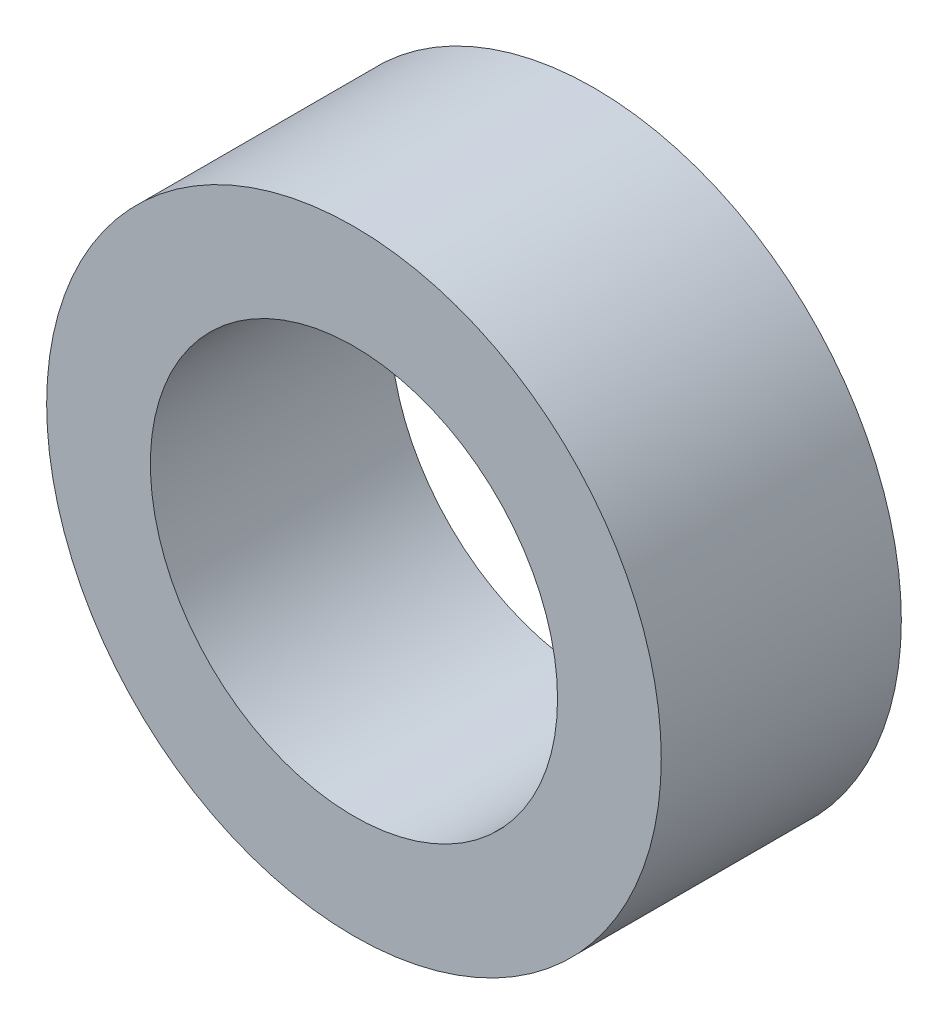
ISO-10303-21;
HEADER;
FILE_DESCRIPTION(('STEP AP214'),'2;1');
FILE_NAME('part.step','',(''),(''),'','','');
FILE_SCHEMA(('AUTOMOTIVE_DESIGN { 1 0 10303 214 1 1 1 1 }'));
ENDSEC;
DATA;
#1=APPLICATION_CONTEXT('core data for automotive mechanical design processes');
#2=APPLICATION_PROTOCOL_DEFINITION('international standard','automotive_design',2000,#1);
#3=PRODUCT_CONTEXT('',#1,'mechanical');
#4=PRODUCT('Part','Part','',(#3));
#5=PRODUCT_RELATED_PRODUCT_CATEGORY('part','',(#4));
#6=PRODUCT_DEFINITION_FORMATION('','',#4);
#7=PRODUCT_DEFINITION_CONTEXT('part definition',#1,'design');
#8=PRODUCT_DEFINITION('design','',#6,#7);
#9=PRODUCT_DEFINITION_SHAPE('','',#8);
#10=(LENGTH_UNIT() NAMED_UNIT(*) SI_UNIT(.MILLI.,.METRE.));
#11=(NAMED_UNIT(*) PLANE_ANGLE_UNIT() SI_UNIT($,.RADIAN.));
#12=(NAMED_UNIT(*) SI_UNIT($,.STERADIAN.) SOLID_ANGLE_UNIT());
#13=UNCERTAINTY_MEASURE_WITH_UNIT(LENGTH_MEASURE(1.E-05),#10,'distance_accuracy_value','');
#14=(GEOMETRIC_REPRESENTATION_CONTEXT(3) GLOBAL_UNCERTAINTY_ASSIGNED_CONTEXT((#13)) GLOBAL_UNIT_ASSIGNED_CONTEXT((#10,
#11,#12)) REPRESENTATION_CONTEXT('',''));
#15=CARTESIAN_POINT('',(0.,0.,0.));
#16=DIRECTION('',(0.,0.,1.));
#17=DIRECTION('',(1.,0.,0.));
#18=AXIS2_PLACEMENT_3D('',#15,#16,#17);
#19=CARTESIAN_POINT('',(0.,0.,3.175));
#20=DIRECTION('',(0.,0.,1.));
#21=DIRECTION('',(1.,0.,0.));
#22=AXIS2_PLACEMENT_3D('',#19,#20,#21);
#23=CYLINDRICAL_SURFACE('',#22,2.65);
#24=CARTESIAN_POINT('',(0.,0.,3.175));
#25=DIRECTION('',(0.,0.,1.));
#26=DIRECTION('',(1.,0.,0.));
#27=AXIS2_PLACEMENT_3D('',#24,#25,#26);
#28=CIRCLE('',#27,2.65);
#29=CARTESIAN_POINT('',(2.65,0.,3.175));
#30=VERTEX_POINT('',#29);
#31=EDGE_CURVE('E27',#30,#30,#28,.F.);
#32=ORIENTED_EDGE('',*,*,#31,.T.);
#33=EDGE_LOOP('',(#32));
#34=FACE_BOUND('',#33,.T.);
#35=CARTESIAN_POINT('',(0.,0.,6.3));
#36=DIRECTION('',(0.,0.,1.));
#37=DIRECTION('',(1.,0.,0.));
#38=AXIS2_PLACEMENT_3D('',#35,#36,#37);
#39=CIRCLE('',#38,2.65);
#40=CARTESIAN_POINT('',(2.65,0.,6.3));
#41=VERTEX_POINT('',#40);
#42=EDGE_CURVE('E18',#41,#41,#39,.F.);
#43=ORIENTED_EDGE('',*,*,#42,.F.);
#44=EDGE_LOOP('',(#43));
#45=FACE_BOUND('',#44,.T.);
#46=ADVANCED_FACE('F15',(#34,#45),#23,.F.);
#47=CARTESIAN_POINT('',(0.,0.,6.3));
#48=DIRECTION('',(0.,0.,1.));
#49=DIRECTION('',(1.,0.,0.));
#50=AXIS2_PLACEMENT_3D('',#47,#48,#49);
#51=PLANE('',#50);
#52=CARTESIAN_POINT('',(0.,0.,6.3));
#53=DIRECTION('',(0.,0.,1.));
#54=DIRECTION('',(1.,0.,0.));
#55=AXIS2_PLACEMENT_3D('',#52,#53,#54);
#56=CIRCLE('',#55,4.);
#57=CARTESIAN_POINT('',(4.,0.,6.3));
#58=VERTEX_POINT('',#57);
#59=EDGE_CURVE('E22',#58,#58,#56,.F.);
#60=ORIENTED_EDGE('',*,*,#59,.F.);
#61=EDGE_LOOP('',(#60));
#62=FACE_BOUND('',#61,.T.);
#63=ORIENTED_EDGE('',*,*,#42,.T.);
#64=EDGE_LOOP('',(#63));
#65=FACE_BOUND('',#64,.T.);
#66=ADVANCED_FACE('F35',(#62,#65),#51,.T.);
#67=CARTESIAN_POINT('',(0.,0.,3.175));
#68=DIRECTION('',(0.,0.,1.));
#69=DIRECTION('',(1.,0.,0.));
#70=AXIS2_PLACEMENT_3D('',#67,#68,#69);
#71=PLANE('',#70);
#72=CARTESIAN_POINT('',(0.,0.,3.175));
#73=DIRECTION('',(0.,0.,1.));
#74=DIRECTION('',(1.,0.,0.));
#75=AXIS2_PLACEMENT_3D('',#72,#73,#74);
#76=CIRCLE('',#75,4.);
#77=CARTESIAN_POINT('',(4.,0.,3.175));
#78=VERTEX_POINT('',#77);
#79=EDGE_CURVE('E10',#78,#78,#76,.T.);
#80=ORIENTED_EDGE('',*,*,#79,.F.);
#81=EDGE_LOOP('',(#80));
#82=FACE_BOUND('',#81,.T.);
#83=ORIENTED_EDGE('',*,*,#31,.F.);
#84=EDGE_LOOP('',(#83));
#85=FACE_BOUND('',#84,.T.);
#86=ADVANCED_FACE('F42',(#82,#85),#71,.F.);
#87=CARTESIAN_POINT('',(0.,0.,3.175));
#88=DIRECTION('',(0.,0.,1.));
#89=DIRECTION('',(1.,0.,0.));
#90=AXIS2_PLACEMENT_3D('',#87,#88,#89);
#91=CYLINDRICAL_SURFACE('',#90,4.);
#92=ORIENTED_EDGE('',*,*,#79,.T.);
#93=EDGE_LOOP('',(#92));
#94=FACE_BOUND('',#93,.T.);
#95=ORIENTED_EDGE('',*,*,#59,.T.);
#96=EDGE_LOOP('',(#95));
#97=FACE_BOUND('',#96,.T.);
#98=ADVANCED_FACE('F44',(#94,#97),#91,.T.);
#99=CLOSED_SHELL('',(#46,#66,#86,#98));
#100=MANIFOLD_SOLID_BREP('B1',#99);
#101=ADVANCED_BREP_SHAPE_REPRESENTATION('',(#18,#100),#14);
#102=SHAPE_DEFINITION_REPRESENTATION(#9,#101);
ENDSEC;
END-ISO-10303-21;
